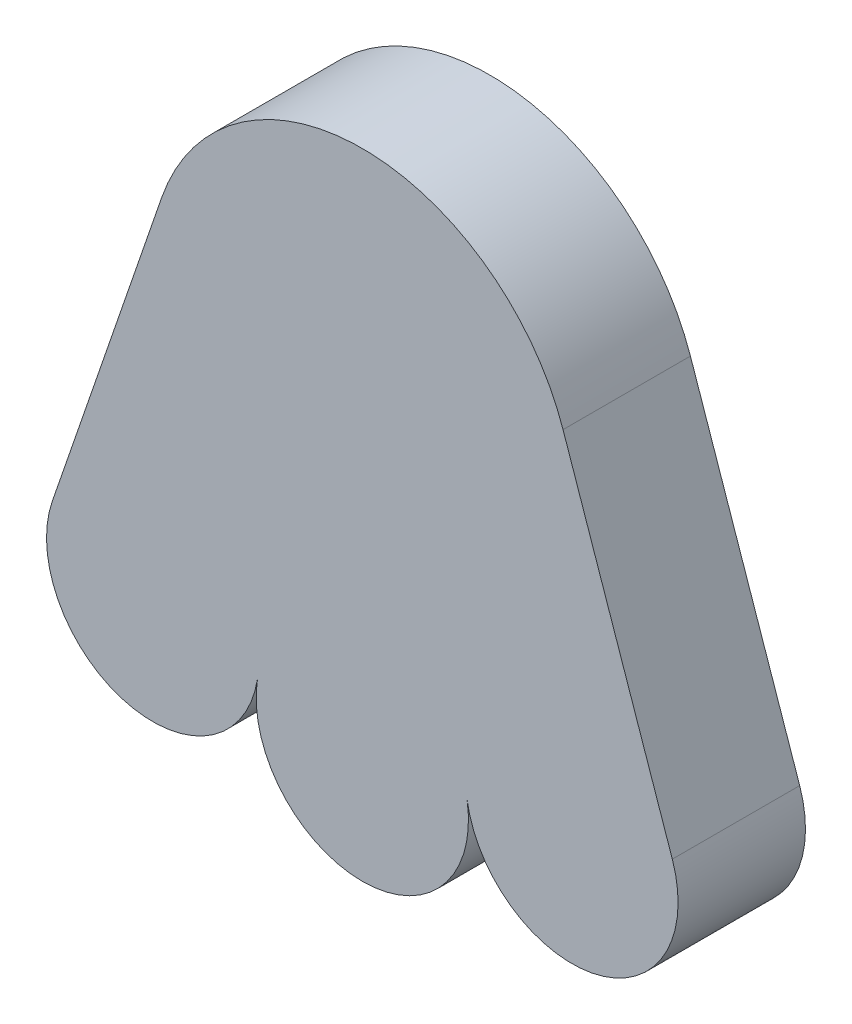
ISO-10303-21;
HEADER;
FILE_DESCRIPTION(('STEP AP214'),'2;1');
FILE_NAME('part.step','',(''),(''),'','','');
FILE_SCHEMA(('AUTOMOTIVE_DESIGN { 1 0 10303 214 1 1 1 1 }'));
ENDSEC;
DATA;
#1=APPLICATION_CONTEXT('core data for automotive mechanical design processes');
#2=APPLICATION_PROTOCOL_DEFINITION('international standard','automotive_design',2000,#1);
#3=PRODUCT_CONTEXT('',#1,'mechanical');
#4=PRODUCT('Part','Part','',(#3));
#5=PRODUCT_RELATED_PRODUCT_CATEGORY('part','',(#4));
#6=PRODUCT_DEFINITION_FORMATION('','',#4);
#7=PRODUCT_DEFINITION_CONTEXT('part definition',#1,'design');
#8=PRODUCT_DEFINITION('design','',#6,#7);
#9=PRODUCT_DEFINITION_SHAPE('','',#8);
#10=(LENGTH_UNIT() NAMED_UNIT(*) SI_UNIT(.MILLI.,.METRE.));
#11=(NAMED_UNIT(*) PLANE_ANGLE_UNIT() SI_UNIT($,.RADIAN.));
#12=(NAMED_UNIT(*) SI_UNIT($,.STERADIAN.) SOLID_ANGLE_UNIT());
#13=UNCERTAINTY_MEASURE_WITH_UNIT(LENGTH_MEASURE(1.E-05),#10,'distance_accuracy_value','');
#14=(GEOMETRIC_REPRESENTATION_CONTEXT(3) GLOBAL_UNCERTAINTY_ASSIGNED_CONTEXT((#13)) GLOBAL_UNIT_ASSIGNED_CONTEXT((#10,
#11,#12)) REPRESENTATION_CONTEXT('',''));
#15=CARTESIAN_POINT('',(0.,0.,0.));
#16=DIRECTION('',(0.,0.,1.));
#17=DIRECTION('',(1.,0.,0.));
#18=AXIS2_PLACEMENT_3D('',#15,#16,#17);
#19=CARTESIAN_POINT('',(0.,-4.4492658070638,3.));
#20=DIRECTION('',(0.,0.,-1.));
#21=DIRECTION('',(-1.,0.,0.));
#22=AXIS2_PLACEMENT_3D('',#19,#20,#21);
#23=CYLINDRICAL_SURFACE('',#22,2.5);
#24=CARTESIAN_POINT('',(0.,-4.4492658070638,0.));
#25=DIRECTION('',(0.,0.,1.));
#26=DIRECTION('',(1.,0.,0.));
#27=AXIS2_PLACEMENT_3D('',#24,#25,#26);
#28=CIRCLE('',#27,2.5);
#29=CARTESIAN_POINT('',(-2.46867496921248,-4.05474851164604,0.));
#30=VERTEX_POINT('',#29);
#31=CARTESIAN_POINT('',(2.46867496921248,-4.05474851164604,0.));
#32=VERTEX_POINT('',#31);
#33=EDGE_CURVE('E132',#30,#32,#28,.T.);
#34=ORIENTED_EDGE('',*,*,#33,.T.);
#35=DIRECTION('',(0.,0.,-1.));
#36=VECTOR('',#35,1.);
#37=CARTESIAN_POINT('',(2.46867496921248,-4.05474851164604,3.));
#38=LINE('',#37,#36);
#39=CARTESIAN_POINT('',(2.46867496921248,-4.05474851164604,3.));
#40=VERTEX_POINT('',#39);
#41=EDGE_CURVE('E11',#40,#32,#38,.T.);
#42=ORIENTED_EDGE('',*,*,#41,.F.);
#43=CARTESIAN_POINT('',(0.,-4.4492658070638,3.));
#44=DIRECTION('',(0.,0.,1.));
#45=DIRECTION('',(1.,0.,0.));
#46=AXIS2_PLACEMENT_3D('',#43,#44,#45);
#47=CIRCLE('',#46,2.5);
#48=CARTESIAN_POINT('',(-2.46867496921248,-4.05474851164604,3.));
#49=VERTEX_POINT('',#48);
#50=EDGE_CURVE('E148',#49,#40,#47,.T.);
#51=ORIENTED_EDGE('',*,*,#50,.F.);
#52=DIRECTION('',(0.,0.,-1.));
#53=VECTOR('',#52,1.);
#54=CARTESIAN_POINT('',(-2.46867496921248,-4.05474851164604,3.));
#55=LINE('',#54,#53);
#56=EDGE_CURVE('E128',#49,#30,#55,.T.);
#57=ORIENTED_EDGE('',*,*,#56,.T.);
#58=EDGE_LOOP('',(#34,#42,#51,#57));
#59=FACE_BOUND('',#58,.T.);
#60=ADVANCED_FACE('F43',(#59),#23,.T.);
#61=CARTESIAN_POINT('',(4.93734993842497,-3.66023121622828,3.));
#62=DIRECTION('',(0.,0.,-1.));
#63=DIRECTION('',(-1.,0.,0.));
#64=AXIS2_PLACEMENT_3D('',#61,#62,#63);
#65=CYLINDRICAL_SURFACE('',#64,2.5);
#66=CARTESIAN_POINT('',(4.93734993842497,-3.66023121622828,0.));
#67=DIRECTION('',(0.,0.,1.));
#68=DIRECTION('',(-1.,0.,0.));
#69=AXIS2_PLACEMENT_3D('',#66,#67,#68);
#70=CIRCLE('',#69,2.5);
#71=CARTESIAN_POINT('',(7.30114669705881,-2.84631175837502,0.));
#72=VERTEX_POINT('',#71);
#73=EDGE_CURVE('E136',#32,#72,#70,.T.);
#74=ORIENTED_EDGE('',*,*,#73,.T.);
#75=DIRECTION('',(0.,0.,-1.));
#76=VECTOR('',#75,1.);
#77=CARTESIAN_POINT('',(7.30114669705881,-2.84631175837502,3.));
#78=LINE('',#77,#76);
#79=CARTESIAN_POINT('',(7.30114669705881,-2.84631175837502,3.));
#80=VERTEX_POINT('',#79);
#81=EDGE_CURVE('E52',#80,#72,#78,.T.);
#82=ORIENTED_EDGE('',*,*,#81,.F.);
#83=CARTESIAN_POINT('',(4.93734993842497,-3.66023121622828,3.));
#84=DIRECTION('',(0.,0.,1.));
#85=DIRECTION('',(-1.,0.,0.));
#86=AXIS2_PLACEMENT_3D('',#83,#84,#85);
#87=CIRCLE('',#86,2.5);
#88=EDGE_CURVE('E97',#40,#80,#87,.T.);
#89=ORIENTED_EDGE('',*,*,#88,.F.);
#90=ORIENTED_EDGE('',*,*,#41,.T.);
#91=EDGE_LOOP('',(#74,#82,#89,#90));
#92=FACE_BOUND('',#91,.T.);
#93=ADVANCED_FACE('F176',(#92),#65,.T.);
#94=CARTESIAN_POINT('',(4.72759351726768,4.62783891570653,3.));
#95=DIRECTION('',(-0.945518703453536,-0.325567783141306,0.));
#96=DIRECTION('',(0.325567783141306,-0.945518703453536,0.));
#97=AXIS2_PLACEMENT_3D('',#94,#95,#96);
#98=PLANE('',#97);
#99=DIRECTION('',(-0.325567783141306,0.945518703453536,0.));
#100=VECTOR('',#99,1.);
#101=CARTESIAN_POINT('',(4.72759351726768,4.62783891570653,0.));
#102=LINE('',#101,#100);
#103=CARTESIAN_POINT('',(4.72759351726768,4.62783891570653,0.));
#104=VERTEX_POINT('',#103);
#105=EDGE_CURVE('E139',#72,#104,#102,.T.);
#106=ORIENTED_EDGE('',*,*,#105,.T.);
#107=DIRECTION('',(0.,0.,-1.));
#108=VECTOR('',#107,1.);
#109=CARTESIAN_POINT('',(4.72759351726768,4.62783891570653,3.));
#110=LINE('',#109,#108);
#111=CARTESIAN_POINT('',(4.72759351726768,4.62783891570653,3.));
#112=VERTEX_POINT('',#111);
#113=EDGE_CURVE('E121',#112,#104,#110,.T.);
#114=ORIENTED_EDGE('',*,*,#113,.F.);
#115=DIRECTION('',(-0.325567783141306,0.945518703453536,0.));
#116=VECTOR('',#115,1.);
#117=CARTESIAN_POINT('',(4.72759351726768,4.62783891570653,3.));
#118=LINE('',#117,#116);
#119=EDGE_CURVE('E110',#80,#112,#118,.T.);
#120=ORIENTED_EDGE('',*,*,#119,.F.);
#121=ORIENTED_EDGE('',*,*,#81,.T.);
#122=EDGE_LOOP('',(#106,#114,#120,#121));
#123=FACE_BOUND('',#122,.T.);
#124=ADVANCED_FACE('F158',(#123),#98,.F.);
#125=CARTESIAN_POINT('',(0.,3.,3.));
#126=DIRECTION('',(0.,0.,-1.));
#127=DIRECTION('',(-1.,0.,0.));
#128=AXIS2_PLACEMENT_3D('',#125,#126,#127);
#129=CYLINDRICAL_SURFACE('',#128,5.);
#130=CARTESIAN_POINT('',(0.,3.,0.));
#131=DIRECTION('',(0.,0.,1.));
#132=DIRECTION('',(1.,0.,0.));
#133=AXIS2_PLACEMENT_3D('',#130,#131,#132);
#134=CIRCLE('',#133,5.);
#135=CARTESIAN_POINT('',(-4.72759351726768,4.62783891570653,0.));
#136=VERTEX_POINT('',#135);
#137=EDGE_CURVE('E119',#104,#136,#134,.T.);
#138=ORIENTED_EDGE('',*,*,#137,.T.);
#139=DIRECTION('',(0.,0.,-1.));
#140=VECTOR('',#139,1.);
#141=CARTESIAN_POINT('',(-4.72759351726768,4.62783891570653,3.));
#142=LINE('',#141,#140);
#143=CARTESIAN_POINT('',(-4.72759351726768,4.62783891570653,3.));
#144=VERTEX_POINT('',#143);
#145=EDGE_CURVE('E116',#144,#136,#142,.T.);
#146=ORIENTED_EDGE('',*,*,#145,.F.);
#147=CARTESIAN_POINT('',(0.,3.,3.));
#148=DIRECTION('',(0.,0.,1.));
#149=DIRECTION('',(1.,0.,0.));
#150=AXIS2_PLACEMENT_3D('',#147,#148,#149);
#151=CIRCLE('',#150,5.);
#152=EDGE_CURVE('E104',#112,#144,#151,.T.);
#153=ORIENTED_EDGE('',*,*,#152,.F.);
#154=ORIENTED_EDGE('',*,*,#113,.T.);
#155=EDGE_LOOP('',(#138,#146,#153,#154));
#156=FACE_BOUND('',#155,.T.);
#157=ADVANCED_FACE('F117',(#156),#129,.T.);
#158=CARTESIAN_POINT('',(-4.72759351726768,4.62783891570653,3.));
#159=DIRECTION('',(0.945518703453536,-0.325567783141306,0.));
#160=DIRECTION('',(0.325567783141306,0.945518703453536,0.));
#161=AXIS2_PLACEMENT_3D('',#158,#159,#160);
#162=PLANE('',#161);
#163=DIRECTION('',(-0.325567783141306,-0.945518703453536,0.));
#164=VECTOR('',#163,1.);
#165=CARTESIAN_POINT('',(-4.72759351726768,4.62783891570653,0.));
#166=LINE('',#165,#164);
#167=CARTESIAN_POINT('',(-7.30114669705881,-2.84631175837502,0.));
#168=VERTEX_POINT('',#167);
#169=EDGE_CURVE('E83',#136,#168,#166,.T.);
#170=ORIENTED_EDGE('',*,*,#169,.T.);
#171=DIRECTION('',(0.,0.,-1.));
#172=VECTOR('',#171,1.);
#173=CARTESIAN_POINT('',(-7.30114669705881,-2.84631175837502,3.));
#174=LINE('',#173,#172);
#175=CARTESIAN_POINT('',(-7.30114669705881,-2.84631175837502,3.));
#176=VERTEX_POINT('',#175);
#177=EDGE_CURVE('E122',#176,#168,#174,.T.);
#178=ORIENTED_EDGE('',*,*,#177,.F.);
#179=DIRECTION('',(-0.325567783141306,-0.945518703453536,0.));
#180=VECTOR('',#179,1.);
#181=CARTESIAN_POINT('',(-4.72759351726768,4.62783891570653,3.));
#182=LINE('',#181,#180);
#183=EDGE_CURVE('E108',#144,#176,#182,.T.);
#184=ORIENTED_EDGE('',*,*,#183,.F.);
#185=ORIENTED_EDGE('',*,*,#145,.T.);
#186=EDGE_LOOP('',(#170,#178,#184,#185));
#187=FACE_BOUND('',#186,.T.);
#188=ADVANCED_FACE('F124',(#187),#162,.F.);
#189=CARTESIAN_POINT('',(-4.93734993842497,-3.66023121622828,3.));
#190=DIRECTION('',(0.,0.,-1.));
#191=DIRECTION('',(-1.,0.,0.));
#192=AXIS2_PLACEMENT_3D('',#189,#190,#191);
#193=CYLINDRICAL_SURFACE('',#192,2.5);
#194=CARTESIAN_POINT('',(-4.93734993842497,-3.66023121622828,0.));
#195=DIRECTION('',(0.,0.,1.));
#196=DIRECTION('',(1.,0.,0.));
#197=AXIS2_PLACEMENT_3D('',#194,#195,#196);
#198=CIRCLE('',#197,2.5);
#199=EDGE_CURVE('E89',#168,#30,#198,.T.);
#200=ORIENTED_EDGE('',*,*,#199,.T.);
#201=ORIENTED_EDGE('',*,*,#56,.F.);
#202=CARTESIAN_POINT('',(-4.93734993842497,-3.66023121622828,3.));
#203=DIRECTION('',(0.,0.,1.));
#204=DIRECTION('',(1.,0.,0.));
#205=AXIS2_PLACEMENT_3D('',#202,#203,#204);
#206=CIRCLE('',#205,2.5);
#207=EDGE_CURVE('E60',#176,#49,#206,.T.);
#208=ORIENTED_EDGE('',*,*,#207,.F.);
#209=ORIENTED_EDGE('',*,*,#177,.T.);
#210=EDGE_LOOP('',(#200,#201,#208,#209));
#211=FACE_BOUND('',#210,.T.);
#212=ADVANCED_FACE('F165',(#211),#193,.T.);
#213=CARTESIAN_POINT('',(0.,-4.4492658070638,3.));
#214=DIRECTION('',(0.,0.,1.));
#215=DIRECTION('',(1.,0.,0.));
#216=AXIS2_PLACEMENT_3D('',#213,#214,#215);
#217=PLANE('',#216);
#218=ORIENTED_EDGE('',*,*,#50,.T.);
#219=ORIENTED_EDGE('',*,*,#88,.T.);
#220=ORIENTED_EDGE('',*,*,#119,.T.);
#221=ORIENTED_EDGE('',*,*,#152,.T.);
#222=ORIENTED_EDGE('',*,*,#183,.T.);
#223=ORIENTED_EDGE('',*,*,#207,.T.);
#224=EDGE_LOOP('',(#218,#219,#220,#221,#222,#223));
#225=FACE_BOUND('',#224,.T.);
#226=ADVANCED_FACE('F106',(#225),#217,.T.);
#227=CARTESIAN_POINT('',(0.,-4.4492658070638,0.));
#228=DIRECTION('',(0.,0.,1.));
#229=DIRECTION('',(1.,0.,0.));
#230=AXIS2_PLACEMENT_3D('',#227,#228,#229);
#231=PLANE('',#230);
#232=ORIENTED_EDGE('',*,*,#33,.F.);
#233=ORIENTED_EDGE('',*,*,#199,.F.);
#234=ORIENTED_EDGE('',*,*,#169,.F.);
#235=ORIENTED_EDGE('',*,*,#137,.F.);
#236=ORIENTED_EDGE('',*,*,#105,.F.);
#237=ORIENTED_EDGE('',*,*,#73,.F.);
#238=EDGE_LOOP('',(#232,#233,#234,#235,#236,#237));
#239=FACE_BOUND('',#238,.T.);
#240=ADVANCED_FACE('F161',(#239),#231,.F.);
#241=CLOSED_SHELL('',(#60,#93,#124,#157,#188,#212,#226,#240));
#242=MANIFOLD_SOLID_BREP('B2',#241);
#243=ADVANCED_BREP_SHAPE_REPRESENTATION('',(#18,#242),#14);
#244=SHAPE_DEFINITION_REPRESENTATION(#9,#243);
ENDSEC;
END-ISO-10303-21;
